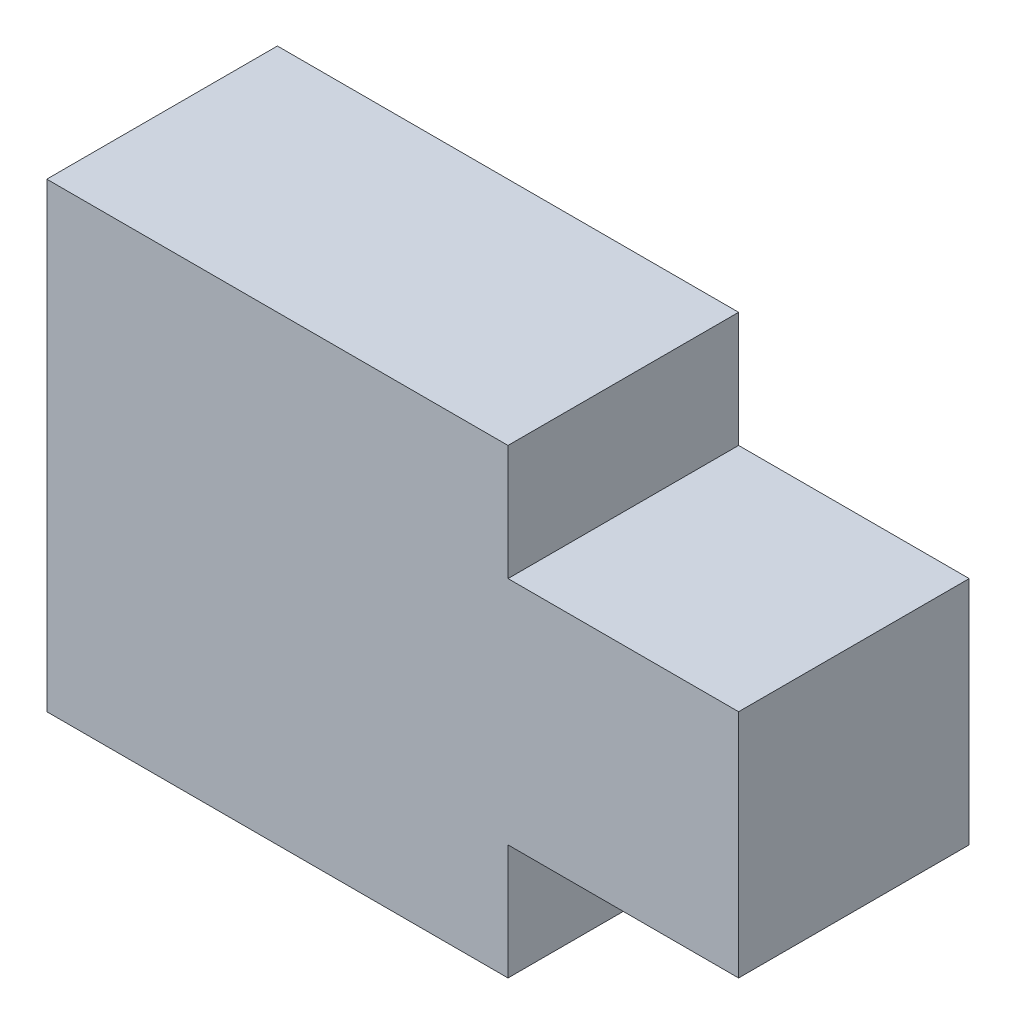
ISO-10303-21;
HEADER;
FILE_DESCRIPTION(('STEP AP214'),'2;1');
FILE_NAME('part.step','',(''),(''),'','','');
FILE_SCHEMA(('AUTOMOTIVE_DESIGN { 1 0 10303 214 1 1 1 1 }'));
ENDSEC;
DATA;
#1=APPLICATION_CONTEXT('core data for automotive mechanical design processes');
#2=APPLICATION_PROTOCOL_DEFINITION('international standard','automotive_design',2000,#1);
#3=PRODUCT_CONTEXT('',#1,'mechanical');
#4=PRODUCT('Part','Part','',(#3));
#5=PRODUCT_RELATED_PRODUCT_CATEGORY('part','',(#4));
#6=PRODUCT_DEFINITION_FORMATION('','',#4);
#7=PRODUCT_DEFINITION_CONTEXT('part definition',#1,'design');
#8=PRODUCT_DEFINITION('design','',#6,#7);
#9=PRODUCT_DEFINITION_SHAPE('','',#8);
#10=(LENGTH_UNIT() NAMED_UNIT(*) SI_UNIT(.MILLI.,.METRE.));
#11=(NAMED_UNIT(*) PLANE_ANGLE_UNIT() SI_UNIT($,.RADIAN.));
#12=(NAMED_UNIT(*) SI_UNIT($,.STERADIAN.) SOLID_ANGLE_UNIT());
#13=UNCERTAINTY_MEASURE_WITH_UNIT(LENGTH_MEASURE(1.E-05),#10,'distance_accuracy_value','');
#14=(GEOMETRIC_REPRESENTATION_CONTEXT(3) GLOBAL_UNCERTAINTY_ASSIGNED_CONTEXT((#13)) GLOBAL_UNIT_ASSIGNED_CONTEXT((#10,
#11,#12)) REPRESENTATION_CONTEXT('',''));
#15=CARTESIAN_POINT('',(0.,0.,0.));
#16=DIRECTION('',(0.,0.,1.));
#17=DIRECTION('',(1.,0.,0.));
#18=AXIS2_PLACEMENT_3D('',#15,#16,#17);
#19=CARTESIAN_POINT('',(100.,0.,50.));
#20=DIRECTION('',(1.,0.,0.));
#21=DIRECTION('',(0.,1.,0.));
#22=AXIS2_PLACEMENT_3D('',#19,#20,#21);
#23=PLANE('',#22);
#24=DIRECTION('',(0.,-1.,0.));
#25=VECTOR('',#24,1.);
#26=CARTESIAN_POINT('',(100.,0.,0.));
#27=LINE('',#26,#25);
#28=CARTESIAN_POINT('',(100.,25.,0.));
#29=VERTEX_POINT('',#28);
#30=CARTESIAN_POINT('',(100.,0.,0.));
#31=VERTEX_POINT('',#30);
#32=EDGE_CURVE('E137',#29,#31,#27,.T.);
#33=ORIENTED_EDGE('',*,*,#32,.F.);
#34=DIRECTION('',(0.,0.,-1.));
#35=VECTOR('',#34,1.);
#36=CARTESIAN_POINT('',(100.,25.,50.));
#37=LINE('',#36,#35);
#38=CARTESIAN_POINT('',(100.,25.,50.));
#39=VERTEX_POINT('',#38);
#40=EDGE_CURVE('E11',#39,#29,#37,.T.);
#41=ORIENTED_EDGE('',*,*,#40,.F.);
#42=DIRECTION('',(0.,-1.,0.));
#43=VECTOR('',#42,1.);
#44=CARTESIAN_POINT('',(100.,0.,50.));
#45=LINE('',#44,#43);
#46=CARTESIAN_POINT('',(100.,0.,50.));
#47=VERTEX_POINT('',#46);
#48=EDGE_CURVE('E165',#39,#47,#45,.T.);
#49=ORIENTED_EDGE('',*,*,#48,.T.);
#50=DIRECTION('',(0.,0.,-1.));
#51=VECTOR('',#50,1.);
#52=CARTESIAN_POINT('',(100.,0.,50.));
#53=LINE('',#52,#51);
#54=EDGE_CURVE('E56',#47,#31,#53,.T.);
#55=ORIENTED_EDGE('',*,*,#54,.T.);
#56=EDGE_LOOP('',(#33,#41,#49,#55));
#57=FACE_BOUND('',#56,.T.);
#58=ADVANCED_FACE('F39',(#57),#23,.T.);
#59=CARTESIAN_POINT('',(0.,25.,50.));
#60=DIRECTION('',(0.,-1.,0.));
#61=DIRECTION('',(1.,0.,0.));
#62=AXIS2_PLACEMENT_3D('',#59,#60,#61);
#63=PLANE('',#62);
#64=DIRECTION('',(-1.,0.,0.));
#65=VECTOR('',#64,1.);
#66=CARTESIAN_POINT('',(0.,25.,0.));
#67=LINE('',#66,#65);
#68=CARTESIAN_POINT('',(150.,25.,0.));
#69=VERTEX_POINT('',#68);
#70=EDGE_CURVE('E140',#69,#29,#67,.T.);
#71=ORIENTED_EDGE('',*,*,#70,.F.);
#72=DIRECTION('',(0.,0.,-1.));
#73=VECTOR('',#72,1.);
#74=CARTESIAN_POINT('',(150.,25.,50.));
#75=LINE('',#74,#73);
#76=CARTESIAN_POINT('',(150.,25.,50.));
#77=VERTEX_POINT('',#76);
#78=EDGE_CURVE('E48',#77,#69,#75,.T.);
#79=ORIENTED_EDGE('',*,*,#78,.F.);
#80=DIRECTION('',(-1.,0.,0.));
#81=VECTOR('',#80,1.);
#82=CARTESIAN_POINT('',(0.,25.,50.));
#83=LINE('',#82,#81);
#84=EDGE_CURVE('E197',#77,#39,#83,.T.);
#85=ORIENTED_EDGE('',*,*,#84,.T.);
#86=ORIENTED_EDGE('',*,*,#40,.T.);
#87=EDGE_LOOP('',(#71,#79,#85,#86));
#88=FACE_BOUND('',#87,.T.);
#89=ADVANCED_FACE('F188',(#88),#63,.T.);
#90=CARTESIAN_POINT('',(150.,0.,50.));
#91=DIRECTION('',(1.,0.,0.));
#92=DIRECTION('',(0.,0.,-1.));
#93=AXIS2_PLACEMENT_3D('',#90,#91,#92);
#94=PLANE('',#93);
#95=DIRECTION('',(0.,-1.,0.));
#96=VECTOR('',#95,1.);
#97=CARTESIAN_POINT('',(150.,0.,0.));
#98=LINE('',#97,#96);
#99=CARTESIAN_POINT('',(150.,75.,0.));
#100=VERTEX_POINT('',#99);
#101=EDGE_CURVE('E144',#100,#69,#98,.T.);
#102=ORIENTED_EDGE('',*,*,#101,.F.);
#103=DIRECTION('',(0.,0.,-1.));
#104=VECTOR('',#103,1.);
#105=CARTESIAN_POINT('',(150.,75.,50.));
#106=LINE('',#105,#104);
#107=CARTESIAN_POINT('',(150.,75.,50.));
#108=VERTEX_POINT('',#107);
#109=EDGE_CURVE('E175',#108,#100,#106,.T.);
#110=ORIENTED_EDGE('',*,*,#109,.F.);
#111=DIRECTION('',(0.,-1.,0.));
#112=VECTOR('',#111,1.);
#113=CARTESIAN_POINT('',(150.,0.,50.));
#114=LINE('',#113,#112);
#115=EDGE_CURVE('E184',#108,#77,#114,.T.);
#116=ORIENTED_EDGE('',*,*,#115,.T.);
#117=ORIENTED_EDGE('',*,*,#78,.T.);
#118=EDGE_LOOP('',(#102,#110,#116,#117));
#119=FACE_BOUND('',#118,.T.);
#120=ADVANCED_FACE('F182',(#119),#94,.T.);
#121=CARTESIAN_POINT('',(0.,75.,50.));
#122=DIRECTION('',(0.,1.,0.));
#123=DIRECTION('',(0.,0.,1.));
#124=AXIS2_PLACEMENT_3D('',#121,#122,#123);
#125=PLANE('',#124);
#126=DIRECTION('',(1.,0.,0.));
#127=VECTOR('',#126,1.);
#128=CARTESIAN_POINT('',(0.,75.,0.));
#129=LINE('',#128,#127);
#130=CARTESIAN_POINT('',(100.,75.,0.));
#131=VERTEX_POINT('',#130);
#132=EDGE_CURVE('E148',#131,#100,#129,.T.);
#133=ORIENTED_EDGE('',*,*,#132,.F.);
#134=DIRECTION('',(0.,0.,-1.));
#135=VECTOR('',#134,1.);
#136=CARTESIAN_POINT('',(100.,75.,50.));
#137=LINE('',#136,#135);
#138=CARTESIAN_POINT('',(100.,75.,50.));
#139=VERTEX_POINT('',#138);
#140=EDGE_CURVE('E172',#139,#131,#137,.T.);
#141=ORIENTED_EDGE('',*,*,#140,.F.);
#142=DIRECTION('',(1.,0.,0.));
#143=VECTOR('',#142,1.);
#144=CARTESIAN_POINT('',(0.,75.,50.));
#145=LINE('',#144,#143);
#146=EDGE_CURVE('E196',#139,#108,#145,.T.);
#147=ORIENTED_EDGE('',*,*,#146,.T.);
#148=ORIENTED_EDGE('',*,*,#109,.T.);
#149=EDGE_LOOP('',(#133,#141,#147,#148));
#150=FACE_BOUND('',#149,.T.);
#151=ADVANCED_FACE('F194',(#150),#125,.T.);
#152=CARTESIAN_POINT('',(100.,0.,50.));
#153=DIRECTION('',(-1.,0.,0.));
#154=DIRECTION('',(0.,0.,1.));
#155=AXIS2_PLACEMENT_3D('',#152,#153,#154);
#156=PLANE('',#155);
#157=DIRECTION('',(0.,1.,0.));
#158=VECTOR('',#157,1.);
#159=CARTESIAN_POINT('',(100.,0.,0.));
#160=LINE('',#159,#158);
#161=CARTESIAN_POINT('',(100.,100.,0.));
#162=VERTEX_POINT('',#161);
#163=EDGE_CURVE('E152',#131,#162,#160,.T.);
#164=ORIENTED_EDGE('',*,*,#163,.T.);
#165=DIRECTION('',(0.,0.,-1.));
#166=VECTOR('',#165,1.);
#167=CARTESIAN_POINT('',(100.,100.,50.));
#168=LINE('',#167,#166);
#169=CARTESIAN_POINT('',(100.,100.,50.));
#170=VERTEX_POINT('',#169);
#171=EDGE_CURVE('E116',#170,#162,#168,.T.);
#172=ORIENTED_EDGE('',*,*,#171,.F.);
#173=DIRECTION('',(0.,1.,0.));
#174=VECTOR('',#173,1.);
#175=CARTESIAN_POINT('',(100.,0.,50.));
#176=LINE('',#175,#174);
#177=EDGE_CURVE('E125',#139,#170,#176,.T.);
#178=ORIENTED_EDGE('',*,*,#177,.F.);
#179=ORIENTED_EDGE('',*,*,#140,.T.);
#180=EDGE_LOOP('',(#164,#172,#178,#179));
#181=FACE_BOUND('',#180,.T.);
#182=ADVANCED_FACE('F228',(#181),#156,.F.);
#183=CARTESIAN_POINT('',(0.,100.,50.));
#184=DIRECTION('',(0.,1.,0.));
#185=DIRECTION('',(0.,0.,1.));
#186=AXIS2_PLACEMENT_3D('',#183,#184,#185);
#187=PLANE('',#186);
#188=DIRECTION('',(1.,0.,0.));
#189=VECTOR('',#188,1.);
#190=CARTESIAN_POINT('',(0.,100.,0.));
#191=LINE('',#190,#189);
#192=CARTESIAN_POINT('',(0.,100.,0.));
#193=VERTEX_POINT('',#192);
#194=EDGE_CURVE('E111',#193,#162,#191,.T.);
#195=ORIENTED_EDGE('',*,*,#194,.F.);
#196=DIRECTION('',(0.,0.,-1.));
#197=VECTOR('',#196,1.);
#198=CARTESIAN_POINT('',(0.,100.,50.));
#199=LINE('',#198,#197);
#200=CARTESIAN_POINT('',(0.,100.,50.));
#201=VERTEX_POINT('',#200);
#202=EDGE_CURVE('E106',#201,#193,#199,.T.);
#203=ORIENTED_EDGE('',*,*,#202,.F.);
#204=DIRECTION('',(1.,0.,0.));
#205=VECTOR('',#204,1.);
#206=CARTESIAN_POINT('',(0.,100.,50.));
#207=LINE('',#206,#205);
#208=EDGE_CURVE('E109',#201,#170,#207,.T.);
#209=ORIENTED_EDGE('',*,*,#208,.T.);
#210=ORIENTED_EDGE('',*,*,#171,.T.);
#211=EDGE_LOOP('',(#195,#203,#209,#210));
#212=FACE_BOUND('',#211,.T.);
#213=ADVANCED_FACE('F108',(#212),#187,.T.);
#214=CARTESIAN_POINT('',(0.,0.,50.));
#215=DIRECTION('',(-1.,0.,0.));
#216=DIRECTION('',(0.,0.,1.));
#217=AXIS2_PLACEMENT_3D('',#214,#215,#216);
#218=PLANE('',#217);
#219=DIRECTION('',(0.,1.,0.));
#220=VECTOR('',#219,1.);
#221=CARTESIAN_POINT('',(0.,0.,0.));
#222=LINE('',#221,#220);
#223=CARTESIAN_POINT('',(0.,0.,0.));
#224=VERTEX_POINT('',#223);
#225=EDGE_CURVE('E158',#224,#193,#222,.T.);
#226=ORIENTED_EDGE('',*,*,#225,.F.);
#227=DIRECTION('',(0.,0.,-1.));
#228=VECTOR('',#227,1.);
#229=CARTESIAN_POINT('',(0.,0.,50.));
#230=LINE('',#229,#228);
#231=CARTESIAN_POINT('',(0.,0.,50.));
#232=VERTEX_POINT('',#231);
#233=EDGE_CURVE('E81',#232,#224,#230,.T.);
#234=ORIENTED_EDGE('',*,*,#233,.F.);
#235=DIRECTION('',(0.,1.,0.));
#236=VECTOR('',#235,1.);
#237=CARTESIAN_POINT('',(0.,0.,50.));
#238=LINE('',#237,#236);
#239=EDGE_CURVE('E122',#232,#201,#238,.T.);
#240=ORIENTED_EDGE('',*,*,#239,.T.);
#241=ORIENTED_EDGE('',*,*,#202,.T.);
#242=EDGE_LOOP('',(#226,#234,#240,#241));
#243=FACE_BOUND('',#242,.T.);
#244=ADVANCED_FACE('F129',(#243),#218,.T.);
#245=CARTESIAN_POINT('',(0.,0.,50.));
#246=DIRECTION('',(0.,-1.,0.));
#247=DIRECTION('',(1.,0.,0.));
#248=AXIS2_PLACEMENT_3D('',#245,#246,#247);
#249=PLANE('',#248);
#250=DIRECTION('',(-1.,0.,0.));
#251=VECTOR('',#250,1.);
#252=CARTESIAN_POINT('',(0.,0.,0.));
#253=LINE('',#252,#251);
#254=EDGE_CURVE('E161',#31,#224,#253,.T.);
#255=ORIENTED_EDGE('',*,*,#254,.F.);
#256=ORIENTED_EDGE('',*,*,#54,.F.);
#257=DIRECTION('',(-1.,0.,0.));
#258=VECTOR('',#257,1.);
#259=CARTESIAN_POINT('',(0.,0.,50.));
#260=LINE('',#259,#258);
#261=EDGE_CURVE('E131',#47,#232,#260,.T.);
#262=ORIENTED_EDGE('',*,*,#261,.T.);
#263=ORIENTED_EDGE('',*,*,#233,.T.);
#264=EDGE_LOOP('',(#255,#256,#262,#263));
#265=FACE_BOUND('',#264,.T.);
#266=ADVANCED_FACE('F207',(#265),#249,.T.);
#267=CARTESIAN_POINT('',(0.,0.,50.));
#268=DIRECTION('',(0.,0.,1.));
#269=DIRECTION('',(1.,0.,0.));
#270=AXIS2_PLACEMENT_3D('',#267,#268,#269);
#271=PLANE('',#270);
#272=ORIENTED_EDGE('',*,*,#48,.F.);
#273=ORIENTED_EDGE('',*,*,#84,.F.);
#274=ORIENTED_EDGE('',*,*,#115,.F.);
#275=ORIENTED_EDGE('',*,*,#146,.F.);
#276=ORIENTED_EDGE('',*,*,#177,.T.);
#277=ORIENTED_EDGE('',*,*,#208,.F.);
#278=ORIENTED_EDGE('',*,*,#239,.F.);
#279=ORIENTED_EDGE('',*,*,#261,.F.);
#280=EDGE_LOOP('',(#272,#273,#274,#275,#276,#277,#278,#279));
#281=FACE_BOUND('',#280,.T.);
#282=ADVANCED_FACE('F120',(#281),#271,.T.);
#283=CARTESIAN_POINT('',(0.,0.,0.));
#284=DIRECTION('',(0.,0.,1.));
#285=DIRECTION('',(1.,0.,0.));
#286=AXIS2_PLACEMENT_3D('',#283,#284,#285);
#287=PLANE('',#286);
#288=ORIENTED_EDGE('',*,*,#32,.T.);
#289=ORIENTED_EDGE('',*,*,#254,.T.);
#290=ORIENTED_EDGE('',*,*,#225,.T.);
#291=ORIENTED_EDGE('',*,*,#194,.T.);
#292=ORIENTED_EDGE('',*,*,#163,.F.);
#293=ORIENTED_EDGE('',*,*,#132,.T.);
#294=ORIENTED_EDGE('',*,*,#101,.T.);
#295=ORIENTED_EDGE('',*,*,#70,.T.);
#296=EDGE_LOOP('',(#288,#289,#290,#291,#292,#293,#294,#295));
#297=FACE_BOUND('',#296,.T.);
#298=ADVANCED_FACE('F190',(#297),#287,.F.);
#299=CLOSED_SHELL('',(#58,#89,#120,#151,#182,#213,#244,#266,#282,#298));
#300=MANIFOLD_SOLID_BREP('B2',#299);
#301=ADVANCED_BREP_SHAPE_REPRESENTATION('',(#18,#300),#14);
#302=SHAPE_DEFINITION_REPRESENTATION(#9,#301);
ENDSEC;
END-ISO-10303-21;
